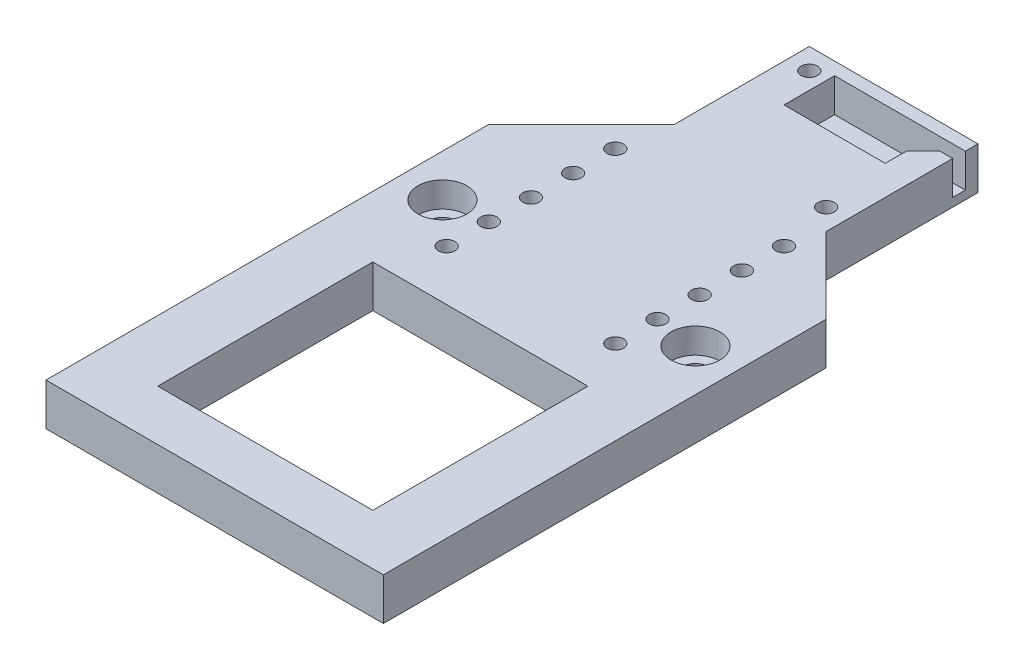
ISO-10303-21;
HEADER;
FILE_DESCRIPTION(('STEP AP214'),'2;1');
FILE_NAME('part.step','',(''),(''),'','','');
FILE_SCHEMA(('AUTOMOTIVE_DESIGN { 1 0 10303 214 1 1 1 1 }'));
ENDSEC;
DATA;
#1=APPLICATION_CONTEXT('core data for automotive mechanical design processes');
#2=APPLICATION_PROTOCOL_DEFINITION('international standard','automotive_design',2000,#1);
#3=PRODUCT_CONTEXT('',#1,'mechanical');
#4=PRODUCT('Part','Part','',(#3));
#5=PRODUCT_RELATED_PRODUCT_CATEGORY('part','',(#4));
#6=PRODUCT_DEFINITION_FORMATION('','',#4);
#7=PRODUCT_DEFINITION_CONTEXT('part definition',#1,'design');
#8=PRODUCT_DEFINITION('design','',#6,#7);
#9=PRODUCT_DEFINITION_SHAPE('','',#8);
#10=(LENGTH_UNIT() NAMED_UNIT(*) SI_UNIT(.MILLI.,.METRE.));
#11=(NAMED_UNIT(*) PLANE_ANGLE_UNIT() SI_UNIT($,.RADIAN.));
#12=(NAMED_UNIT(*) SI_UNIT($,.STERADIAN.) SOLID_ANGLE_UNIT());
#13=UNCERTAINTY_MEASURE_WITH_UNIT(LENGTH_MEASURE(1.E-05),#10,'distance_accuracy_value','');
#14=(GEOMETRIC_REPRESENTATION_CONTEXT(3) GLOBAL_UNCERTAINTY_ASSIGNED_CONTEXT((#13)) GLOBAL_UNIT_ASSIGNED_CONTEXT((#10,
#11,#12)) REPRESENTATION_CONTEXT('',''));
#15=CARTESIAN_POINT('',(0.,0.,0.));
#16=DIRECTION('',(0.,0.,1.));
#17=DIRECTION('',(1.,0.,0.));
#18=AXIS2_PLACEMENT_3D('',#15,#16,#17);
#19=CARTESIAN_POINT('',(-10.,0.,-0.5));
#20=DIRECTION('',(0.,1.,0.));
#21=DIRECTION('',(0.,0.,1.));
#22=AXIS2_PLACEMENT_3D('',#19,#20,#21);
#23=CYLINDRICAL_SURFACE('',#22,0.975);
#24=CARTESIAN_POINT('',(-10.,0.,-0.5));
#25=DIRECTION('',(0.,1.,0.));
#26=DIRECTION('',(0.,0.,1.));
#27=AXIS2_PLACEMENT_3D('',#24,#25,#26);
#28=CIRCLE('',#27,0.975);
#29=CARTESIAN_POINT('',(-10.,0.,0.474999999999999));
#30=VERTEX_POINT('',#29);
#31=EDGE_CURVE('E393',#30,#30,#28,.T.);
#32=ORIENTED_EDGE('',*,*,#31,.F.);
#33=EDGE_LOOP('',(#32));
#34=FACE_BOUND('',#33,.T.);
#35=CARTESIAN_POINT('',(-10.,5.,-0.5));
#36=DIRECTION('',(0.,1.,0.));
#37=DIRECTION('',(0.,0.,1.));
#38=AXIS2_PLACEMENT_3D('',#35,#36,#37);
#39=CIRCLE('',#38,0.975);
#40=CARTESIAN_POINT('',(-10.,5.,0.474999999999999));
#41=VERTEX_POINT('',#40);
#42=EDGE_CURVE('E396',#41,#41,#39,.T.);
#43=ORIENTED_EDGE('',*,*,#42,.T.);
#44=EDGE_LOOP('',(#43));
#45=FACE_BOUND('',#44,.T.);
#46=ADVANCED_FACE('F35',(#34,#45),#23,.F.);
#47=CARTESIAN_POINT('',(-10.,0.,4.5));
#48=DIRECTION('',(0.,1.,0.));
#49=DIRECTION('',(0.,0.,1.));
#50=AXIS2_PLACEMENT_3D('',#47,#48,#49);
#51=CYLINDRICAL_SURFACE('',#50,0.975);
#52=CARTESIAN_POINT('',(-10.,0.,4.5));
#53=DIRECTION('',(0.,1.,0.));
#54=DIRECTION('',(0.,0.,1.));
#55=AXIS2_PLACEMENT_3D('',#52,#53,#54);
#56=CIRCLE('',#55,0.975);
#57=CARTESIAN_POINT('',(-10.,0.,5.475));
#58=VERTEX_POINT('',#57);
#59=EDGE_CURVE('E387',#58,#58,#56,.T.);
#60=ORIENTED_EDGE('',*,*,#59,.F.);
#61=EDGE_LOOP('',(#60));
#62=FACE_BOUND('',#61,.T.);
#63=CARTESIAN_POINT('',(-10.,5.,4.5));
#64=DIRECTION('',(0.,1.,0.));
#65=DIRECTION('',(0.,0.,1.));
#66=AXIS2_PLACEMENT_3D('',#63,#64,#65);
#67=CIRCLE('',#66,0.975);
#68=CARTESIAN_POINT('',(-10.,5.,5.475));
#69=VERTEX_POINT('',#68);
#70=EDGE_CURVE('E390',#69,#69,#67,.T.);
#71=ORIENTED_EDGE('',*,*,#70,.T.);
#72=EDGE_LOOP('',(#71));
#73=FACE_BOUND('',#72,.T.);
#74=ADVANCED_FACE('F489',(#62,#73),#51,.F.);
#75=CARTESIAN_POINT('',(-10.,0.,9.5));
#76=DIRECTION('',(0.,1.,0.));
#77=DIRECTION('',(0.,0.,1.));
#78=AXIS2_PLACEMENT_3D('',#75,#76,#77);
#79=CYLINDRICAL_SURFACE('',#78,0.975);
#80=CARTESIAN_POINT('',(-10.,0.,9.5));
#81=DIRECTION('',(0.,1.,0.));
#82=DIRECTION('',(0.,0.,1.));
#83=AXIS2_PLACEMENT_3D('',#80,#81,#82);
#84=CIRCLE('',#83,0.975);
#85=CARTESIAN_POINT('',(-10.,0.,10.475));
#86=VERTEX_POINT('',#85);
#87=EDGE_CURVE('E381',#86,#86,#84,.T.);
#88=ORIENTED_EDGE('',*,*,#87,.F.);
#89=EDGE_LOOP('',(#88));
#90=FACE_BOUND('',#89,.T.);
#91=CARTESIAN_POINT('',(-10.,5.,9.5));
#92=DIRECTION('',(0.,1.,0.));
#93=DIRECTION('',(0.,0.,1.));
#94=AXIS2_PLACEMENT_3D('',#91,#92,#93);
#95=CIRCLE('',#94,0.975);
#96=CARTESIAN_POINT('',(-10.,5.,10.475));
#97=VERTEX_POINT('',#96);
#98=EDGE_CURVE('E384',#97,#97,#95,.T.);
#99=ORIENTED_EDGE('',*,*,#98,.T.);
#100=EDGE_LOOP('',(#99));
#101=FACE_BOUND('',#100,.T.);
#102=ADVANCED_FACE('F494',(#90,#101),#79,.F.);
#103=CARTESIAN_POINT('',(10.,0.,-0.500000000000004));
#104=DIRECTION('',(0.,1.,0.));
#105=DIRECTION('',(0.,0.,1.));
#106=AXIS2_PLACEMENT_3D('',#103,#104,#105);
#107=CYLINDRICAL_SURFACE('',#106,0.975);
#108=CARTESIAN_POINT('',(10.,0.,-0.500000000000004));
#109=DIRECTION('',(0.,1.,0.));
#110=DIRECTION('',(0.,0.,-1.));
#111=AXIS2_PLACEMENT_3D('',#108,#109,#110);
#112=CIRCLE('',#111,0.975);
#113=CARTESIAN_POINT('',(10.,0.,-1.475));
#114=VERTEX_POINT('',#113);
#115=EDGE_CURVE('E375',#114,#114,#112,.T.);
#116=ORIENTED_EDGE('',*,*,#115,.F.);
#117=EDGE_LOOP('',(#116));
#118=FACE_BOUND('',#117,.T.);
#119=CARTESIAN_POINT('',(10.,5.,-0.500000000000004));
#120=DIRECTION('',(0.,1.,0.));
#121=DIRECTION('',(0.,0.,-1.));
#122=AXIS2_PLACEMENT_3D('',#119,#120,#121);
#123=CIRCLE('',#122,0.975);
#124=CARTESIAN_POINT('',(10.,5.,-1.475));
#125=VERTEX_POINT('',#124);
#126=EDGE_CURVE('E378',#125,#125,#123,.T.);
#127=ORIENTED_EDGE('',*,*,#126,.T.);
#128=EDGE_LOOP('',(#127));
#129=FACE_BOUND('',#128,.T.);
#130=ADVANCED_FACE('F502',(#118,#129),#107,.F.);
#131=CARTESIAN_POINT('',(10.,0.,4.5));
#132=DIRECTION('',(0.,1.,0.));
#133=DIRECTION('',(0.,0.,1.));
#134=AXIS2_PLACEMENT_3D('',#131,#132,#133);
#135=CYLINDRICAL_SURFACE('',#134,0.975);
#136=CARTESIAN_POINT('',(10.,0.,4.5));
#137=DIRECTION('',(0.,1.,0.));
#138=DIRECTION('',(0.,0.,-1.));
#139=AXIS2_PLACEMENT_3D('',#136,#137,#138);
#140=CIRCLE('',#139,0.975);
#141=CARTESIAN_POINT('',(10.,0.,3.525));
#142=VERTEX_POINT('',#141);
#143=EDGE_CURVE('E369',#142,#142,#140,.T.);
#144=ORIENTED_EDGE('',*,*,#143,.F.);
#145=EDGE_LOOP('',(#144));
#146=FACE_BOUND('',#145,.T.);
#147=CARTESIAN_POINT('',(10.,5.,4.5));
#148=DIRECTION('',(0.,1.,0.));
#149=DIRECTION('',(0.,0.,-1.));
#150=AXIS2_PLACEMENT_3D('',#147,#148,#149);
#151=CIRCLE('',#150,0.975);
#152=CARTESIAN_POINT('',(10.,5.,3.525));
#153=VERTEX_POINT('',#152);
#154=EDGE_CURVE('E372',#153,#153,#151,.T.);
#155=ORIENTED_EDGE('',*,*,#154,.T.);
#156=EDGE_LOOP('',(#155));
#157=FACE_BOUND('',#156,.T.);
#158=ADVANCED_FACE('F506',(#146,#157),#135,.F.);
#159=CARTESIAN_POINT('',(10.,0.,9.49999999999999));
#160=DIRECTION('',(0.,1.,0.));
#161=DIRECTION('',(0.,0.,1.));
#162=AXIS2_PLACEMENT_3D('',#159,#160,#161);
#163=CYLINDRICAL_SURFACE('',#162,0.975);
#164=CARTESIAN_POINT('',(10.,0.,9.49999999999999));
#165=DIRECTION('',(0.,1.,0.));
#166=DIRECTION('',(0.,0.,-1.));
#167=AXIS2_PLACEMENT_3D('',#164,#165,#166);
#168=CIRCLE('',#167,0.975);
#169=CARTESIAN_POINT('',(10.,0.,8.525));
#170=VERTEX_POINT('',#169);
#171=EDGE_CURVE('E356',#170,#170,#168,.T.);
#172=ORIENTED_EDGE('',*,*,#171,.F.);
#173=EDGE_LOOP('',(#172));
#174=FACE_BOUND('',#173,.T.);
#175=CARTESIAN_POINT('',(10.,5.,9.49999999999999));
#176=DIRECTION('',(0.,1.,0.));
#177=DIRECTION('',(0.,0.,-1.));
#178=AXIS2_PLACEMENT_3D('',#175,#176,#177);
#179=CIRCLE('',#178,0.975);
#180=CARTESIAN_POINT('',(10.,5.,8.525));
#181=VERTEX_POINT('',#180);
#182=EDGE_CURVE('E366',#181,#181,#179,.T.);
#183=ORIENTED_EDGE('',*,*,#182,.T.);
#184=EDGE_LOOP('',(#183));
#185=FACE_BOUND('',#184,.T.);
#186=ADVANCED_FACE('F510',(#174,#185),#163,.F.);
#187=CARTESIAN_POINT('',(0.,5.,0.));
#188=DIRECTION('',(0.,-1.,0.));
#189=DIRECTION('',(0.,0.,-1.));
#190=AXIS2_PLACEMENT_3D('',#187,#188,#189);
#191=PLANE('',#190);
#192=DIRECTION('',(0.,0.,-1.));
#193=VECTOR('',#192,1.);
#194=CARTESIAN_POINT('',(20.,5.,22.5));
#195=LINE('',#194,#193);
#196=CARTESIAN_POINT('',(20.,5.,57.));
#197=VERTEX_POINT('',#196);
#198=CARTESIAN_POINT('',(20.,5.,4.50000000000006));
#199=VERTEX_POINT('',#198);
#200=EDGE_CURVE('E186',#197,#199,#195,.T.);
#201=ORIENTED_EDGE('',*,*,#200,.T.);
#202=DIRECTION('',(0.707106781186544,0.,0.707106781186551));
#203=VECTOR('',#202,1.);
#204=CARTESIAN_POINT('',(11.,5.,-4.50000000000001));
#205=LINE('',#204,#203);
#206=CARTESIAN_POINT('',(11.,5.,-4.50000000000001));
#207=VERTEX_POINT('',#206);
#208=EDGE_CURVE('E227',#207,#199,#205,.T.);
#209=ORIENTED_EDGE('',*,*,#208,.F.);
#210=DIRECTION('',(0.,0.,1.));
#211=VECTOR('',#210,1.);
#212=CARTESIAN_POINT('',(11.,5.,-22.5));
#213=LINE('',#212,#211);
#214=CARTESIAN_POINT('',(11.,5.,-19.5));
#215=VERTEX_POINT('',#214);
#216=EDGE_CURVE('E212',#215,#207,#213,.T.);
#217=ORIENTED_EDGE('',*,*,#216,.F.);
#218=DIRECTION('',(1.,0.,0.));
#219=VECTOR('',#218,1.);
#220=CARTESIAN_POINT('',(15.5,5.,-19.5));
#221=LINE('',#220,#219);
#222=CARTESIAN_POINT('',(9.5,5.,-19.5));
#223=VERTEX_POINT('',#222);
#224=EDGE_CURVE('E265',#223,#215,#221,.T.);
#225=ORIENTED_EDGE('',*,*,#224,.F.);
#226=DIRECTION('',(0.707106781186545,0.,-0.70710678118655));
#227=VECTOR('',#226,1.);
#228=CARTESIAN_POINT('',(9.5,5.,-19.5));
#229=LINE('',#228,#227);
#230=CARTESIAN_POINT('',(7.5,5.,-17.5));
#231=VERTEX_POINT('',#230);
#232=EDGE_CURVE('E402',#223,#231,#229,.F.);
#233=ORIENTED_EDGE('',*,*,#232,.T.);
#234=DIRECTION('',(0.,0.,-1.));
#235=VECTOR('',#234,1.);
#236=CARTESIAN_POINT('',(7.5,5.,-19.5));
#237=LINE('',#236,#235);
#238=CARTESIAN_POINT('',(7.5,5.,-15.));
#239=VERTEX_POINT('',#238);
#240=EDGE_CURVE('E268',#239,#231,#237,.T.);
#241=ORIENTED_EDGE('',*,*,#240,.F.);
#242=DIRECTION('',(1.,0.,0.));
#243=VECTOR('',#242,1.);
#244=CARTESIAN_POINT('',(-4.5,5.,-15.));
#245=LINE('',#244,#243);
#246=CARTESIAN_POINT('',(-4.5,5.,-15.));
#247=VERTEX_POINT('',#246);
#248=EDGE_CURVE('E271',#247,#239,#245,.T.);
#249=ORIENTED_EDGE('',*,*,#248,.F.);
#250=DIRECTION('',(0.,0.,1.));
#251=VECTOR('',#250,1.);
#252=CARTESIAN_POINT('',(-4.5,5.,-21.));
#253=LINE('',#252,#251);
#254=CARTESIAN_POINT('',(-4.5,5.,-21.));
#255=VERTEX_POINT('',#254);
#256=EDGE_CURVE('E258',#255,#247,#253,.T.);
#257=ORIENTED_EDGE('',*,*,#256,.F.);
#258=DIRECTION('',(-1.,0.,0.));
#259=VECTOR('',#258,1.);
#260=CARTESIAN_POINT('',(-4.5,5.,-21.));
#261=LINE('',#260,#259);
#262=CARTESIAN_POINT('',(11.,5.,-21.));
#263=VERTEX_POINT('',#262);
#264=EDGE_CURVE('E262',#263,#255,#261,.T.);
#265=ORIENTED_EDGE('',*,*,#264,.F.);
#266=CARTESIAN_POINT('',(11.,5.,-22.5));
#267=VERTEX_POINT('',#266);
#268=EDGE_CURVE('E50',#267,#263,#213,.T.);
#269=ORIENTED_EDGE('',*,*,#268,.F.);
#270=DIRECTION('',(-1.,0.,0.));
#271=VECTOR('',#270,1.);
#272=CARTESIAN_POINT('',(-20.,5.,-22.5));
#273=LINE('',#272,#271);
#274=CARTESIAN_POINT('',(-9.00000000000001,5.,-22.5));
#275=VERTEX_POINT('',#274);
#276=EDGE_CURVE('E352',#267,#275,#273,.T.);
#277=ORIENTED_EDGE('',*,*,#276,.T.);
#278=DIRECTION('',(0.,0.,-1.));
#279=VECTOR('',#278,1.);
#280=CARTESIAN_POINT('',(-9.00000000000001,5.,-22.5));
#281=LINE('',#280,#279);
#282=CARTESIAN_POINT('',(-9.00000000000001,5.,-6.49999999999985));
#283=VERTEX_POINT('',#282);
#284=EDGE_CURVE('E247',#283,#275,#281,.T.);
#285=ORIENTED_EDGE('',*,*,#284,.F.);
#286=DIRECTION('',(0.70710678118655,0.,-0.707106781186545));
#287=VECTOR('',#286,1.);
#288=CARTESIAN_POINT('',(-9.00000000000001,5.,-6.49999999999985));
#289=LINE('',#288,#287);
#290=CARTESIAN_POINT('',(-20.,5.,4.50000000000006));
#291=VERTEX_POINT('',#290);
#292=EDGE_CURVE('E244',#291,#283,#289,.T.);
#293=ORIENTED_EDGE('',*,*,#292,.F.);
#294=DIRECTION('',(0.,0.,1.));
#295=VECTOR('',#294,1.);
#296=CARTESIAN_POINT('',(-20.,5.,22.5));
#297=LINE('',#296,#295);
#298=CARTESIAN_POINT('',(-20.,5.,57.));
#299=VERTEX_POINT('',#298);
#300=EDGE_CURVE('E355',#291,#299,#297,.T.);
#301=ORIENTED_EDGE('',*,*,#300,.T.);
#302=DIRECTION('',(1.,0.,0.));
#303=VECTOR('',#302,1.);
#304=CARTESIAN_POINT('',(-20.,5.,57.));
#305=LINE('',#304,#303);
#306=EDGE_CURVE('E208',#299,#197,#305,.T.);
#307=ORIENTED_EDGE('',*,*,#306,.T.);
#308=EDGE_LOOP('',(#201,#209,#217,#225,#233,#241,#249,#257,#265,#269,#277,#285,#293,#301,#307));
#309=FACE_BOUND('',#308,.T.);
#310=CARTESIAN_POINT('',(-10.,5.,14.5));
#311=DIRECTION('',(0.,1.,0.));
#312=DIRECTION('',(0.,0.,1.));
#313=AXIS2_PLACEMENT_3D('',#310,#311,#312);
#314=CIRCLE('',#313,0.975);
#315=CARTESIAN_POINT('',(-10.,5.,15.475));
#316=VERTEX_POINT('',#315);
#317=EDGE_CURVE('E299',#316,#316,#314,.T.);
#318=ORIENTED_EDGE('',*,*,#317,.F.);
#319=EDGE_LOOP('',(#318));
#320=FACE_BOUND('',#319,.T.);
#321=CARTESIAN_POINT('',(10.,5.,14.5));
#322=DIRECTION('',(0.,1.,0.));
#323=DIRECTION('',(0.,0.,-1.));
#324=AXIS2_PLACEMENT_3D('',#321,#322,#323);
#325=CIRCLE('',#324,0.975);
#326=CARTESIAN_POINT('',(10.,5.,13.525));
#327=VERTEX_POINT('',#326);
#328=EDGE_CURVE('E305',#327,#327,#325,.T.);
#329=ORIENTED_EDGE('',*,*,#328,.F.);
#330=EDGE_LOOP('',(#329));
#331=FACE_BOUND('',#330,.T.);
#332=CARTESIAN_POINT('',(10.,5.,19.5));
#333=DIRECTION('',(0.,1.,0.));
#334=DIRECTION('',(0.,0.,-1.));
#335=AXIS2_PLACEMENT_3D('',#332,#333,#334);
#336=CIRCLE('',#335,0.975);
#337=CARTESIAN_POINT('',(10.,5.,18.525));
#338=VERTEX_POINT('',#337);
#339=EDGE_CURVE('E308',#338,#338,#336,.T.);
#340=ORIENTED_EDGE('',*,*,#339,.F.);
#341=EDGE_LOOP('',(#340));
#342=FACE_BOUND('',#341,.T.);
#343=CARTESIAN_POINT('',(-10.,5.,19.5));
#344=DIRECTION('',(0.,1.,0.));
#345=DIRECTION('',(0.,0.,1.));
#346=AXIS2_PLACEMENT_3D('',#343,#344,#345);
#347=CIRCLE('',#346,0.975);
#348=CARTESIAN_POINT('',(-10.,5.,20.475));
#349=VERTEX_POINT('',#348);
#350=EDGE_CURVE('E312',#349,#349,#347,.T.);
#351=ORIENTED_EDGE('',*,*,#350,.F.);
#352=EDGE_LOOP('',(#351));
#353=FACE_BOUND('',#352,.T.);
#354=CARTESIAN_POINT('',(8.49999999999999,5.,-7.));
#355=DIRECTION('',(0.,1.,0.));
#356=DIRECTION('',(0.,0.,1.));
#357=AXIS2_PLACEMENT_3D('',#354,#355,#356);
#358=CIRCLE('',#357,0.975);
#359=CARTESIAN_POINT('',(8.49999999999999,5.,-6.025));
#360=VERTEX_POINT('',#359);
#361=EDGE_CURVE('E318',#360,#360,#358,.T.);
#362=ORIENTED_EDGE('',*,*,#361,.F.);
#363=EDGE_LOOP('',(#362));
#364=FACE_BOUND('',#363,.T.);
#365=CARTESIAN_POINT('',(-6.50000000000001,5.,-20.));
#366=DIRECTION('',(0.,1.,0.));
#367=DIRECTION('',(0.,0.,1.));
#368=AXIS2_PLACEMENT_3D('',#365,#366,#367);
#369=CIRCLE('',#368,0.975);
#370=CARTESIAN_POINT('',(-6.50000000000001,5.,-19.025));
#371=VERTEX_POINT('',#370);
#372=EDGE_CURVE('E324',#371,#371,#369,.T.);
#373=ORIENTED_EDGE('',*,*,#372,.F.);
#374=EDGE_LOOP('',(#373));
#375=FACE_BOUND('',#374,.T.);
#376=CARTESIAN_POINT('',(15.,5.,15.));
#377=DIRECTION('',(0.,1.,0.));
#378=DIRECTION('',(0.,0.,1.));
#379=AXIS2_PLACEMENT_3D('',#376,#377,#378);
#380=CIRCLE('',#379,2.9);
#381=CARTESIAN_POINT('',(15.,5.,17.9));
#382=VERTEX_POINT('',#381);
#383=EDGE_CURVE('E330',#382,#382,#380,.T.);
#384=ORIENTED_EDGE('',*,*,#383,.F.);
#385=EDGE_LOOP('',(#384));
#386=FACE_BOUND('',#385,.T.);
#387=CARTESIAN_POINT('',(-15.,5.,15.));
#388=DIRECTION('',(0.,1.,0.));
#389=DIRECTION('',(0.,0.,1.));
#390=AXIS2_PLACEMENT_3D('',#387,#388,#389);
#391=CIRCLE('',#390,2.9);
#392=CARTESIAN_POINT('',(-15.,5.,17.9));
#393=VERTEX_POINT('',#392);
#394=EDGE_CURVE('E339',#393,#393,#391,.T.);
#395=ORIENTED_EDGE('',*,*,#394,.F.);
#396=EDGE_LOOP('',(#395));
#397=FACE_BOUND('',#396,.T.);
#398=ORIENTED_EDGE('',*,*,#182,.F.);
#399=EDGE_LOOP('',(#398));
#400=FACE_BOUND('',#399,.T.);
#401=ORIENTED_EDGE('',*,*,#154,.F.);
#402=EDGE_LOOP('',(#401));
#403=FACE_BOUND('',#402,.T.);
#404=ORIENTED_EDGE('',*,*,#126,.F.);
#405=EDGE_LOOP('',(#404));
#406=FACE_BOUND('',#405,.T.);
#407=ORIENTED_EDGE('',*,*,#98,.F.);
#408=EDGE_LOOP('',(#407));
#409=FACE_BOUND('',#408,.T.);
#410=ORIENTED_EDGE('',*,*,#70,.F.);
#411=EDGE_LOOP('',(#410));
#412=FACE_BOUND('',#411,.T.);
#413=ORIENTED_EDGE('',*,*,#42,.F.);
#414=EDGE_LOOP('',(#413));
#415=FACE_BOUND('',#414,.T.);
#416=DIRECTION('',(0.,0.,-1.));
#417=VECTOR('',#416,1.);
#418=CARTESIAN_POINT('',(12.75,5.,51.));
#419=LINE('',#418,#417);
#420=CARTESIAN_POINT('',(12.75,5.,51.));
#421=VERTEX_POINT('',#420);
#422=CARTESIAN_POINT('',(12.75,5.,25.5));
#423=VERTEX_POINT('',#422);
#424=EDGE_CURVE('E199',#421,#423,#419,.T.);
#425=ORIENTED_EDGE('',*,*,#424,.F.);
#426=DIRECTION('',(1.,0.,0.));
#427=VECTOR('',#426,1.);
#428=CARTESIAN_POINT('',(-12.75,5.,51.));
#429=LINE('',#428,#427);
#430=CARTESIAN_POINT('',(-12.75,5.,51.));
#431=VERTEX_POINT('',#430);
#432=EDGE_CURVE('E218',#431,#421,#429,.T.);
#433=ORIENTED_EDGE('',*,*,#432,.F.);
#434=DIRECTION('',(0.,0.,1.));
#435=VECTOR('',#434,1.);
#436=CARTESIAN_POINT('',(-12.75,5.,51.));
#437=LINE('',#436,#435);
#438=CARTESIAN_POINT('',(-12.75,5.,25.5));
#439=VERTEX_POINT('',#438);
#440=EDGE_CURVE('E221',#439,#431,#437,.T.);
#441=ORIENTED_EDGE('',*,*,#440,.F.);
#442=DIRECTION('',(-1.,0.,0.));
#443=VECTOR('',#442,1.);
#444=CARTESIAN_POINT('',(-12.75,5.,25.5));
#445=LINE('',#444,#443);
#446=EDGE_CURVE('E224',#423,#439,#445,.T.);
#447=ORIENTED_EDGE('',*,*,#446,.F.);
#448=EDGE_LOOP('',(#425,#433,#441,#447));
#449=FACE_BOUND('',#448,.T.);
#450=ADVANCED_FACE('F417',(#309,#320,#331,#342,#353,#364,#375,#386,#397,#400,#403,#406,#409,
#412,#415,#449),#191,.F.);
#451=CARTESIAN_POINT('',(0.,0.,0.));
#452=DIRECTION('',(0.,-1.,0.));
#453=DIRECTION('',(0.,0.,-1.));
#454=AXIS2_PLACEMENT_3D('',#451,#452,#453);
#455=PLANE('',#454);
#456=DIRECTION('',(0.707106781186544,0.,0.707106781186551));
#457=VECTOR('',#456,1.);
#458=CARTESIAN_POINT('',(11.,0.,-4.50000000000001));
#459=LINE('',#458,#457);
#460=CARTESIAN_POINT('',(11.,0.,-4.50000000000001));
#461=VERTEX_POINT('',#460);
#462=CARTESIAN_POINT('',(20.,0.,4.50000000000006));
#463=VERTEX_POINT('',#462);
#464=EDGE_CURVE('E176',#461,#463,#459,.T.);
#465=ORIENTED_EDGE('',*,*,#464,.T.);
#466=DIRECTION('',(0.,0.,-1.));
#467=VECTOR('',#466,1.);
#468=CARTESIAN_POINT('',(20.,0.,22.5));
#469=LINE('',#468,#467);
#470=CARTESIAN_POINT('',(20.,0.,57.));
#471=VERTEX_POINT('',#470);
#472=EDGE_CURVE('E166',#471,#463,#469,.T.);
#473=ORIENTED_EDGE('',*,*,#472,.F.);
#474=DIRECTION('',(1.,0.,0.));
#475=VECTOR('',#474,1.);
#476=CARTESIAN_POINT('',(-20.,0.,57.));
#477=LINE('',#476,#475);
#478=CARTESIAN_POINT('',(-20.,0.,57.));
#479=VERTEX_POINT('',#478);
#480=EDGE_CURVE('E172',#479,#471,#477,.T.);
#481=ORIENTED_EDGE('',*,*,#480,.F.);
#482=DIRECTION('',(0.,0.,1.));
#483=VECTOR('',#482,1.);
#484=CARTESIAN_POINT('',(-20.,0.,22.5));
#485=LINE('',#484,#483);
#486=CARTESIAN_POINT('',(-20.,0.,4.50000000000006));
#487=VERTEX_POINT('',#486);
#488=EDGE_CURVE('E353',#487,#479,#485,.T.);
#489=ORIENTED_EDGE('',*,*,#488,.F.);
#490=DIRECTION('',(0.70710678118655,0.,-0.707106781186545));
#491=VECTOR('',#490,1.);
#492=CARTESIAN_POINT('',(-9.00000000000001,0.,-6.49999999999985));
#493=LINE('',#492,#491);
#494=CARTESIAN_POINT('',(-9.00000000000001,0.,-6.49999999999985));
#495=VERTEX_POINT('',#494);
#496=EDGE_CURVE('E57',#487,#495,#493,.T.);
#497=ORIENTED_EDGE('',*,*,#496,.T.);
#498=DIRECTION('',(0.,0.,-1.));
#499=VECTOR('',#498,1.);
#500=CARTESIAN_POINT('',(-9.00000000000001,0.,-22.5));
#501=LINE('',#500,#499);
#502=CARTESIAN_POINT('',(-9.00000000000001,0.,-22.5));
#503=VERTEX_POINT('',#502);
#504=EDGE_CURVE('E246',#495,#503,#501,.T.);
#505=ORIENTED_EDGE('',*,*,#504,.T.);
#506=DIRECTION('',(-1.,0.,0.));
#507=VECTOR('',#506,1.);
#508=CARTESIAN_POINT('',(-20.,0.,-22.5));
#509=LINE('',#508,#507);
#510=CARTESIAN_POINT('',(11.,0.,-22.5));
#511=VERTEX_POINT('',#510);
#512=EDGE_CURVE('E179',#511,#503,#509,.T.);
#513=ORIENTED_EDGE('',*,*,#512,.F.);
#514=DIRECTION('',(0.,0.,1.));
#515=VECTOR('',#514,1.);
#516=CARTESIAN_POINT('',(11.,0.,-22.5));
#517=LINE('',#516,#515);
#518=EDGE_CURVE('E225',#511,#461,#517,.T.);
#519=ORIENTED_EDGE('',*,*,#518,.T.);
#520=EDGE_LOOP('',(#465,#473,#481,#489,#497,#505,#513,#519));
#521=FACE_BOUND('',#520,.T.);
#522=CARTESIAN_POINT('',(-10.,0.,14.5));
#523=DIRECTION('',(0.,1.,0.));
#524=DIRECTION('',(0.,0.,1.));
#525=AXIS2_PLACEMENT_3D('',#522,#523,#524);
#526=CIRCLE('',#525,0.975);
#527=CARTESIAN_POINT('',(-10.,0.,15.475));
#528=VERTEX_POINT('',#527);
#529=EDGE_CURVE('E296',#528,#528,#526,.T.);
#530=ORIENTED_EDGE('',*,*,#529,.T.);
#531=EDGE_LOOP('',(#530));
#532=FACE_BOUND('',#531,.T.);
#533=CARTESIAN_POINT('',(10.,0.,14.5));
#534=DIRECTION('',(0.,1.,0.));
#535=DIRECTION('',(0.,0.,-1.));
#536=AXIS2_PLACEMENT_3D('',#533,#534,#535);
#537=CIRCLE('',#536,0.975);
#538=CARTESIAN_POINT('',(10.,0.,13.525));
#539=VERTEX_POINT('',#538);
#540=EDGE_CURVE('E302',#539,#539,#537,.T.);
#541=ORIENTED_EDGE('',*,*,#540,.T.);
#542=EDGE_LOOP('',(#541));
#543=FACE_BOUND('',#542,.T.);
#544=CARTESIAN_POINT('',(10.,0.,19.5));
#545=DIRECTION('',(0.,1.,0.));
#546=DIRECTION('',(0.,0.,-1.));
#547=AXIS2_PLACEMENT_3D('',#544,#545,#546);
#548=CIRCLE('',#547,0.975);
#549=CARTESIAN_POINT('',(10.,0.,18.525));
#550=VERTEX_POINT('',#549);
#551=EDGE_CURVE('E309',#550,#550,#548,.T.);
#552=ORIENTED_EDGE('',*,*,#551,.T.);
#553=EDGE_LOOP('',(#552));
#554=FACE_BOUND('',#553,.T.);
#555=CARTESIAN_POINT('',(-10.,0.,19.5));
#556=DIRECTION('',(0.,1.,0.));
#557=DIRECTION('',(0.,0.,1.));
#558=AXIS2_PLACEMENT_3D('',#555,#556,#557);
#559=CIRCLE('',#558,0.975);
#560=CARTESIAN_POINT('',(-10.,0.,20.475));
#561=VERTEX_POINT('',#560);
#562=EDGE_CURVE('E315',#561,#561,#559,.T.);
#563=ORIENTED_EDGE('',*,*,#562,.T.);
#564=EDGE_LOOP('',(#563));
#565=FACE_BOUND('',#564,.T.);
#566=CARTESIAN_POINT('',(8.49999999999999,0.,-7.));
#567=DIRECTION('',(0.,1.,0.));
#568=DIRECTION('',(0.,0.,1.));
#569=AXIS2_PLACEMENT_3D('',#566,#567,#568);
#570=CIRCLE('',#569,0.975);
#571=CARTESIAN_POINT('',(8.49999999999999,0.,-6.025));
#572=VERTEX_POINT('',#571);
#573=EDGE_CURVE('E321',#572,#572,#570,.T.);
#574=ORIENTED_EDGE('',*,*,#573,.T.);
#575=EDGE_LOOP('',(#574));
#576=FACE_BOUND('',#575,.T.);
#577=CARTESIAN_POINT('',(-6.50000000000001,0.,-20.));
#578=DIRECTION('',(0.,1.,0.));
#579=DIRECTION('',(0.,0.,1.));
#580=AXIS2_PLACEMENT_3D('',#577,#578,#579);
#581=CIRCLE('',#580,0.975);
#582=CARTESIAN_POINT('',(-6.50000000000001,0.,-19.025));
#583=VERTEX_POINT('',#582);
#584=EDGE_CURVE('E327',#583,#583,#581,.T.);
#585=ORIENTED_EDGE('',*,*,#584,.T.);
#586=EDGE_LOOP('',(#585));
#587=FACE_BOUND('',#586,.T.);
#588=CARTESIAN_POINT('',(15.,0.,15.));
#589=DIRECTION('',(0.,1.,0.));
#590=DIRECTION('',(0.,0.,-1.));
#591=AXIS2_PLACEMENT_3D('',#588,#589,#590);
#592=CIRCLE('',#591,1.7);
#593=CARTESIAN_POINT('',(15.,0.,13.3));
#594=VERTEX_POINT('',#593);
#595=EDGE_CURVE('E346',#594,#594,#592,.T.);
#596=ORIENTED_EDGE('',*,*,#595,.T.);
#597=EDGE_LOOP('',(#596));
#598=FACE_BOUND('',#597,.T.);
#599=CARTESIAN_POINT('',(-15.,0.,15.));
#600=DIRECTION('',(0.,1.,0.));
#601=DIRECTION('',(0.,0.,1.));
#602=AXIS2_PLACEMENT_3D('',#599,#600,#601);
#603=CIRCLE('',#602,1.7);
#604=CARTESIAN_POINT('',(-15.,0.,16.7));
#605=VERTEX_POINT('',#604);
#606=EDGE_CURVE('E180',#605,#605,#603,.T.);
#607=ORIENTED_EDGE('',*,*,#606,.T.);
#608=EDGE_LOOP('',(#607));
#609=FACE_BOUND('',#608,.T.);
#610=ORIENTED_EDGE('',*,*,#171,.T.);
#611=EDGE_LOOP('',(#610));
#612=FACE_BOUND('',#611,.T.);
#613=ORIENTED_EDGE('',*,*,#143,.T.);
#614=EDGE_LOOP('',(#613));
#615=FACE_BOUND('',#614,.T.);
#616=ORIENTED_EDGE('',*,*,#115,.T.);
#617=EDGE_LOOP('',(#616));
#618=FACE_BOUND('',#617,.T.);
#619=ORIENTED_EDGE('',*,*,#87,.T.);
#620=EDGE_LOOP('',(#619));
#621=FACE_BOUND('',#620,.T.);
#622=ORIENTED_EDGE('',*,*,#59,.T.);
#623=EDGE_LOOP('',(#622));
#624=FACE_BOUND('',#623,.T.);
#625=ORIENTED_EDGE('',*,*,#31,.T.);
#626=EDGE_LOOP('',(#625));
#627=FACE_BOUND('',#626,.T.);
#628=DIRECTION('',(1.,0.,0.));
#629=VECTOR('',#628,1.);
#630=CARTESIAN_POINT('',(-12.75,0.,51.));
#631=LINE('',#630,#629);
#632=CARTESIAN_POINT('',(-12.75,0.,51.));
#633=VERTEX_POINT('',#632);
#634=CARTESIAN_POINT('',(12.75,0.,51.));
#635=VERTEX_POINT('',#634);
#636=EDGE_CURVE('E205',#633,#635,#631,.T.);
#637=ORIENTED_EDGE('',*,*,#636,.T.);
#638=DIRECTION('',(0.,0.,-1.));
#639=VECTOR('',#638,1.);
#640=CARTESIAN_POINT('',(12.75,0.,51.));
#641=LINE('',#640,#639);
#642=CARTESIAN_POINT('',(12.75,0.,25.5));
#643=VERTEX_POINT('',#642);
#644=EDGE_CURVE('E201',#635,#643,#641,.T.);
#645=ORIENTED_EDGE('',*,*,#644,.T.);
#646=DIRECTION('',(-1.,0.,0.));
#647=VECTOR('',#646,1.);
#648=CARTESIAN_POINT('',(-12.75,0.,25.5));
#649=LINE('',#648,#647);
#650=CARTESIAN_POINT('',(-12.75,0.,25.5));
#651=VERTEX_POINT('',#650);
#652=EDGE_CURVE('E204',#643,#651,#649,.T.);
#653=ORIENTED_EDGE('',*,*,#652,.T.);
#654=DIRECTION('',(0.,0.,1.));
#655=VECTOR('',#654,1.);
#656=CARTESIAN_POINT('',(-12.75,0.,51.));
#657=LINE('',#656,#655);
#658=EDGE_CURVE('E209',#651,#633,#657,.T.);
#659=ORIENTED_EDGE('',*,*,#658,.T.);
#660=EDGE_LOOP('',(#637,#645,#653,#659));
#661=FACE_BOUND('',#660,.T.);
#662=ADVANCED_FACE('F168',(#521,#532,#543,#554,#565,#576,#587,#598,#609,#612,#615,#618,#621,
#624,#627,#661),#455,.T.);
#663=CARTESIAN_POINT('',(20.,5.,22.5));
#664=DIRECTION('',(-1.,0.,0.));
#665=DIRECTION('',(0.,0.,1.));
#666=AXIS2_PLACEMENT_3D('',#663,#664,#665);
#667=PLANE('',#666);
#668=ORIENTED_EDGE('',*,*,#472,.T.);
#669=DIRECTION('',(0.,1.,0.));
#670=VECTOR('',#669,1.);
#671=CARTESIAN_POINT('',(20.,0.,4.50000000000006));
#672=LINE('',#671,#670);
#673=EDGE_CURVE('E232',#463,#199,#672,.T.);
#674=ORIENTED_EDGE('',*,*,#673,.T.);
#675=ORIENTED_EDGE('',*,*,#200,.F.);
#676=DIRECTION('',(0.,1.,0.));
#677=VECTOR('',#676,1.);
#678=CARTESIAN_POINT('',(20.,-52.8228170396089,57.));
#679=LINE('',#678,#677);
#680=EDGE_CURVE('E183',#471,#197,#679,.T.);
#681=ORIENTED_EDGE('',*,*,#680,.F.);
#682=EDGE_LOOP('',(#668,#674,#675,#681));
#683=FACE_BOUND('',#682,.T.);
#684=ADVANCED_FACE('F184',(#683),#667,.F.);
#685=CARTESIAN_POINT('',(-20.,5.,-22.5));
#686=DIRECTION('',(0.,0.,1.));
#687=DIRECTION('',(1.,0.,0.));
#688=AXIS2_PLACEMENT_3D('',#685,#686,#687);
#689=PLANE('',#688);
#690=ORIENTED_EDGE('',*,*,#276,.F.);
#691=DIRECTION('',(0.,1.,0.));
#692=VECTOR('',#691,1.);
#693=CARTESIAN_POINT('',(11.,0.,-22.5));
#694=LINE('',#693,#692);
#695=EDGE_CURVE('E229',#511,#267,#694,.T.);
#696=ORIENTED_EDGE('',*,*,#695,.F.);
#697=ORIENTED_EDGE('',*,*,#512,.T.);
#698=DIRECTION('',(0.,1.,0.));
#699=VECTOR('',#698,1.);
#700=CARTESIAN_POINT('',(-9.00000000000001,0.,-22.5));
#701=LINE('',#700,#699);
#702=EDGE_CURVE('E255',#503,#275,#701,.T.);
#703=ORIENTED_EDGE('',*,*,#702,.T.);
#704=EDGE_LOOP('',(#690,#696,#697,#703));
#705=FACE_BOUND('',#704,.T.);
#706=ADVANCED_FACE('F444',(#705),#689,.F.);
#707=CARTESIAN_POINT('',(-20.,5.,22.5));
#708=DIRECTION('',(1.,0.,0.));
#709=DIRECTION('',(0.,0.,-1.));
#710=AXIS2_PLACEMENT_3D('',#707,#708,#709);
#711=PLANE('',#710);
#712=ORIENTED_EDGE('',*,*,#300,.F.);
#713=DIRECTION('',(0.,1.,0.));
#714=VECTOR('',#713,1.);
#715=CARTESIAN_POINT('',(-20.,0.,4.50000000000006));
#716=LINE('',#715,#714);
#717=EDGE_CURVE('E250',#487,#291,#716,.T.);
#718=ORIENTED_EDGE('',*,*,#717,.F.);
#719=ORIENTED_EDGE('',*,*,#488,.T.);
#720=DIRECTION('',(0.,1.,0.));
#721=VECTOR('',#720,1.);
#722=CARTESIAN_POINT('',(-20.,-52.8228170396089,57.));
#723=LINE('',#722,#721);
#724=EDGE_CURVE('E194',#479,#299,#723,.T.);
#725=ORIENTED_EDGE('',*,*,#724,.T.);
#726=EDGE_LOOP('',(#712,#718,#719,#725));
#727=FACE_BOUND('',#726,.T.);
#728=ADVANCED_FACE('F453',(#727),#711,.F.);
#729=CARTESIAN_POINT('',(-15.,5.,15.));
#730=DIRECTION('',(0.,-1.,0.));
#731=DIRECTION('',(0.,0.,-1.));
#732=AXIS2_PLACEMENT_3D('',#729,#730,#731);
#733=CYLINDRICAL_SURFACE('',#732,1.7);
#734=CARTESIAN_POINT('',(-15.,2.,15.));
#735=DIRECTION('',(0.,-1.,0.));
#736=DIRECTION('',(0.,0.,-1.));
#737=AXIS2_PLACEMENT_3D('',#734,#735,#736);
#738=CIRCLE('',#737,1.7);
#739=CARTESIAN_POINT('',(-15.,2.,13.3));
#740=VERTEX_POINT('',#739);
#741=EDGE_CURVE('E345',#740,#740,#738,.T.);
#742=ORIENTED_EDGE('',*,*,#741,.F.);
#743=EDGE_LOOP('',(#742));
#744=FACE_BOUND('',#743,.T.);
#745=ORIENTED_EDGE('',*,*,#606,.F.);
#746=EDGE_LOOP('',(#745));
#747=FACE_BOUND('',#746,.T.);
#748=ADVANCED_FACE('F521',(#744,#747),#733,.F.);
#749=CARTESIAN_POINT('',(15.,5.,15.));
#750=DIRECTION('',(0.,-1.,0.));
#751=DIRECTION('',(0.,0.,-1.));
#752=AXIS2_PLACEMENT_3D('',#749,#750,#751);
#753=CYLINDRICAL_SURFACE('',#752,1.7);
#754=CARTESIAN_POINT('',(15.,2.,15.));
#755=DIRECTION('',(0.,-1.,0.));
#756=DIRECTION('',(0.,0.,-1.));
#757=AXIS2_PLACEMENT_3D('',#754,#755,#756);
#758=CIRCLE('',#757,1.7);
#759=CARTESIAN_POINT('',(15.,2.,13.3));
#760=VERTEX_POINT('',#759);
#761=EDGE_CURVE('E338',#760,#760,#758,.T.);
#762=ORIENTED_EDGE('',*,*,#761,.F.);
#763=EDGE_LOOP('',(#762));
#764=FACE_BOUND('',#763,.T.);
#765=ORIENTED_EDGE('',*,*,#595,.F.);
#766=EDGE_LOOP('',(#765));
#767=FACE_BOUND('',#766,.T.);
#768=ADVANCED_FACE('F528',(#764,#767),#753,.F.);
#769=CARTESIAN_POINT('',(0.,2.,0.));
#770=DIRECTION('',(0.,-1.,0.));
#771=DIRECTION('',(0.,0.,-1.));
#772=AXIS2_PLACEMENT_3D('',#769,#770,#771);
#773=PLANE('',#772);
#774=ORIENTED_EDGE('',*,*,#741,.T.);
#775=EDGE_LOOP('',(#774));
#776=FACE_BOUND('',#775,.T.);
#777=CARTESIAN_POINT('',(-15.,2.,15.));
#778=DIRECTION('',(0.,-1.,0.));
#779=DIRECTION('',(0.,0.,-1.));
#780=AXIS2_PLACEMENT_3D('',#777,#778,#779);
#781=CIRCLE('',#780,2.9);
#782=CARTESIAN_POINT('',(-15.,2.,12.1));
#783=VERTEX_POINT('',#782);
#784=EDGE_CURVE('E342',#783,#783,#781,.F.);
#785=ORIENTED_EDGE('',*,*,#784,.T.);
#786=EDGE_LOOP('',(#785));
#787=FACE_BOUND('',#786,.T.);
#788=ADVANCED_FACE('F532',(#776,#787),#773,.F.);
#789=CARTESIAN_POINT('',(-15.,-8.20243866176395,15.));
#790=DIRECTION('',(0.,1.,0.));
#791=DIRECTION('',(0.,0.,1.));
#792=AXIS2_PLACEMENT_3D('',#789,#790,#791);
#793=CYLINDRICAL_SURFACE('',#792,2.9);
#794=ORIENTED_EDGE('',*,*,#394,.T.);
#795=EDGE_LOOP('',(#794));
#796=FACE_BOUND('',#795,.T.);
#797=ORIENTED_EDGE('',*,*,#784,.F.);
#798=EDGE_LOOP('',(#797));
#799=FACE_BOUND('',#798,.T.);
#800=ADVANCED_FACE('F536',(#796,#799),#793,.F.);
#801=CARTESIAN_POINT('',(0.,2.,0.));
#802=DIRECTION('',(0.,-1.,0.));
#803=DIRECTION('',(0.,0.,-1.));
#804=AXIS2_PLACEMENT_3D('',#801,#802,#803);
#805=PLANE('',#804);
#806=ORIENTED_EDGE('',*,*,#761,.T.);
#807=EDGE_LOOP('',(#806));
#808=FACE_BOUND('',#807,.T.);
#809=CARTESIAN_POINT('',(15.,2.,15.));
#810=DIRECTION('',(0.,-1.,0.));
#811=DIRECTION('',(0.,0.,-1.));
#812=AXIS2_PLACEMENT_3D('',#809,#810,#811);
#813=CIRCLE('',#812,2.9);
#814=CARTESIAN_POINT('',(15.,2.,12.1));
#815=VERTEX_POINT('',#814);
#816=EDGE_CURVE('E335',#815,#815,#813,.F.);
#817=ORIENTED_EDGE('',*,*,#816,.T.);
#818=EDGE_LOOP('',(#817));
#819=FACE_BOUND('',#818,.T.);
#820=ADVANCED_FACE('F540',(#808,#819),#805,.F.);
#821=CARTESIAN_POINT('',(15.,-8.20243866176395,15.));
#822=DIRECTION('',(0.,1.,0.));
#823=DIRECTION('',(0.,0.,1.));
#824=AXIS2_PLACEMENT_3D('',#821,#822,#823);
#825=CYLINDRICAL_SURFACE('',#824,2.9);
#826=ORIENTED_EDGE('',*,*,#383,.T.);
#827=EDGE_LOOP('',(#826));
#828=FACE_BOUND('',#827,.T.);
#829=ORIENTED_EDGE('',*,*,#816,.F.);
#830=EDGE_LOOP('',(#829));
#831=FACE_BOUND('',#830,.T.);
#832=ADVANCED_FACE('F544',(#828,#831),#825,.F.);
#833=CARTESIAN_POINT('',(-6.50000000000001,0.,-20.));
#834=DIRECTION('',(0.,1.,0.));
#835=DIRECTION('',(0.,0.,1.));
#836=AXIS2_PLACEMENT_3D('',#833,#834,#835);
#837=CYLINDRICAL_SURFACE('',#836,0.975);
#838=ORIENTED_EDGE('',*,*,#584,.F.);
#839=EDGE_LOOP('',(#838));
#840=FACE_BOUND('',#839,.T.);
#841=ORIENTED_EDGE('',*,*,#372,.T.);
#842=EDGE_LOOP('',(#841));
#843=FACE_BOUND('',#842,.T.);
#844=ADVANCED_FACE('F548',(#840,#843),#837,.F.);
#845=CARTESIAN_POINT('',(8.49999999999999,0.,-7.));
#846=DIRECTION('',(0.,1.,0.));
#847=DIRECTION('',(0.,0.,1.));
#848=AXIS2_PLACEMENT_3D('',#845,#846,#847);
#849=CYLINDRICAL_SURFACE('',#848,0.975);
#850=ORIENTED_EDGE('',*,*,#573,.F.);
#851=EDGE_LOOP('',(#850));
#852=FACE_BOUND('',#851,.T.);
#853=ORIENTED_EDGE('',*,*,#361,.T.);
#854=EDGE_LOOP('',(#853));
#855=FACE_BOUND('',#854,.T.);
#856=ADVANCED_FACE('F552',(#852,#855),#849,.F.);
#857=CARTESIAN_POINT('',(-10.,0.,19.5));
#858=DIRECTION('',(0.,1.,0.));
#859=DIRECTION('',(0.,0.,1.));
#860=AXIS2_PLACEMENT_3D('',#857,#858,#859);
#861=CYLINDRICAL_SURFACE('',#860,0.975);
#862=ORIENTED_EDGE('',*,*,#562,.F.);
#863=EDGE_LOOP('',(#862));
#864=FACE_BOUND('',#863,.T.);
#865=ORIENTED_EDGE('',*,*,#350,.T.);
#866=EDGE_LOOP('',(#865));
#867=FACE_BOUND('',#866,.T.);
#868=ADVANCED_FACE('F556',(#864,#867),#861,.F.);
#869=CARTESIAN_POINT('',(10.,0.,19.5));
#870=DIRECTION('',(0.,1.,0.));
#871=DIRECTION('',(0.,0.,1.));
#872=AXIS2_PLACEMENT_3D('',#869,#870,#871);
#873=CYLINDRICAL_SURFACE('',#872,0.975);
#874=ORIENTED_EDGE('',*,*,#551,.F.);
#875=EDGE_LOOP('',(#874));
#876=FACE_BOUND('',#875,.T.);
#877=ORIENTED_EDGE('',*,*,#339,.T.);
#878=EDGE_LOOP('',(#877));
#879=FACE_BOUND('',#878,.T.);
#880=ADVANCED_FACE('F560',(#876,#879),#873,.F.);
#881=CARTESIAN_POINT('',(10.,0.,14.5));
#882=DIRECTION('',(0.,1.,0.));
#883=DIRECTION('',(0.,0.,1.));
#884=AXIS2_PLACEMENT_3D('',#881,#882,#883);
#885=CYLINDRICAL_SURFACE('',#884,0.975);
#886=ORIENTED_EDGE('',*,*,#540,.F.);
#887=EDGE_LOOP('',(#886));
#888=FACE_BOUND('',#887,.T.);
#889=ORIENTED_EDGE('',*,*,#328,.T.);
#890=EDGE_LOOP('',(#889));
#891=FACE_BOUND('',#890,.T.);
#892=ADVANCED_FACE('F564',(#888,#891),#885,.F.);
#893=CARTESIAN_POINT('',(-10.,0.,14.5));
#894=DIRECTION('',(0.,1.,0.));
#895=DIRECTION('',(0.,0.,1.));
#896=AXIS2_PLACEMENT_3D('',#893,#894,#895);
#897=CYLINDRICAL_SURFACE('',#896,0.975);
#898=ORIENTED_EDGE('',*,*,#529,.F.);
#899=EDGE_LOOP('',(#898));
#900=FACE_BOUND('',#899,.T.);
#901=ORIENTED_EDGE('',*,*,#317,.T.);
#902=EDGE_LOOP('',(#901));
#903=FACE_BOUND('',#902,.T.);
#904=ADVANCED_FACE('F568',(#900,#903),#897,.F.);
#905=CARTESIAN_POINT('',(0.,1.,0.));
#906=DIRECTION('',(0.,-1.,0.));
#907=DIRECTION('',(0.,0.,-1.));
#908=AXIS2_PLACEMENT_3D('',#905,#906,#907);
#909=PLANE('',#908);
#910=DIRECTION('',(1.,0.,0.));
#911=VECTOR('',#910,1.);
#912=CARTESIAN_POINT('',(15.5,1.,-19.5));
#913=LINE('',#912,#911);
#914=CARTESIAN_POINT('',(9.5,1.,-19.5));
#915=VERTEX_POINT('',#914);
#916=CARTESIAN_POINT('',(11.,1.,-19.5));
#917=VERTEX_POINT('',#916);
#918=EDGE_CURVE('E286',#915,#917,#913,.T.);
#919=ORIENTED_EDGE('',*,*,#918,.T.);
#920=DIRECTION('',(0.,0.,-1.));
#921=VECTOR('',#920,1.);
#922=CARTESIAN_POINT('',(11.,1.,0.));
#923=LINE('',#922,#921);
#924=CARTESIAN_POINT('',(11.,1.,-21.));
#925=VERTEX_POINT('',#924);
#926=EDGE_CURVE('E234',#917,#925,#923,.T.);
#927=ORIENTED_EDGE('',*,*,#926,.T.);
#928=DIRECTION('',(-1.,0.,0.));
#929=VECTOR('',#928,1.);
#930=CARTESIAN_POINT('',(-4.5,1.,-21.));
#931=LINE('',#930,#929);
#932=CARTESIAN_POINT('',(-4.5,1.,-21.));
#933=VERTEX_POINT('',#932);
#934=EDGE_CURVE('E284',#925,#933,#931,.T.);
#935=ORIENTED_EDGE('',*,*,#934,.T.);
#936=DIRECTION('',(0.,0.,1.));
#937=VECTOR('',#936,1.);
#938=CARTESIAN_POINT('',(-4.5,1.,-21.));
#939=LINE('',#938,#937);
#940=CARTESIAN_POINT('',(-4.5,1.,-15.));
#941=VERTEX_POINT('',#940);
#942=EDGE_CURVE('E279',#933,#941,#939,.T.);
#943=ORIENTED_EDGE('',*,*,#942,.T.);
#944=DIRECTION('',(1.,0.,0.));
#945=VECTOR('',#944,1.);
#946=CARTESIAN_POINT('',(-4.5,1.,-15.));
#947=LINE('',#946,#945);
#948=CARTESIAN_POINT('',(7.5,1.,-15.));
#949=VERTEX_POINT('',#948);
#950=EDGE_CURVE('E264',#941,#949,#947,.T.);
#951=ORIENTED_EDGE('',*,*,#950,.T.);
#952=DIRECTION('',(0.,0.,-1.));
#953=VECTOR('',#952,1.);
#954=CARTESIAN_POINT('',(7.5,1.,-19.5));
#955=LINE('',#954,#953);
#956=CARTESIAN_POINT('',(7.5,1.,-17.5));
#957=VERTEX_POINT('',#956);
#958=EDGE_CURVE('E289',#949,#957,#955,.T.);
#959=ORIENTED_EDGE('',*,*,#958,.T.);
#960=DIRECTION('',(-0.707106781186545,0.,0.70710678118655));
#961=VECTOR('',#960,1.);
#962=CARTESIAN_POINT('',(-4.99999999999996,1.,-4.99999999999993));
#963=LINE('',#962,#961);
#964=EDGE_CURVE('E43',#957,#915,#963,.F.);
#965=ORIENTED_EDGE('',*,*,#964,.T.);
#966=EDGE_LOOP('',(#919,#927,#935,#943,#951,#959,#965));
#967=FACE_BOUND('',#966,.T.);
#968=ADVANCED_FACE('F408',(#967),#909,.F.);
#969=CARTESIAN_POINT('',(-4.5,-20.8806130178211,-15.));
#970=DIRECTION('',(0.,0.,1.));
#971=DIRECTION('',(1.,0.,0.));
#972=AXIS2_PLACEMENT_3D('',#969,#970,#971);
#973=PLANE('',#972);
#974=DIRECTION('',(0.,1.,0.));
#975=VECTOR('',#974,1.);
#976=CARTESIAN_POINT('',(-4.5,-20.8806130178211,-15.));
#977=LINE('',#976,#975);
#978=EDGE_CURVE('E282',#941,#247,#977,.T.);
#979=ORIENTED_EDGE('',*,*,#978,.T.);
#980=ORIENTED_EDGE('',*,*,#248,.T.);
#981=DIRECTION('',(0.,1.,0.));
#982=VECTOR('',#981,1.);
#983=CARTESIAN_POINT('',(7.5,-20.8806130178211,-15.));
#984=LINE('',#983,#982);
#985=EDGE_CURVE('E278',#949,#239,#984,.T.);
#986=ORIENTED_EDGE('',*,*,#985,.F.);
#987=ORIENTED_EDGE('',*,*,#950,.F.);
#988=EDGE_LOOP('',(#979,#980,#986,#987));
#989=FACE_BOUND('',#988,.T.);
#990=ADVANCED_FACE('F425',(#989),#973,.F.);
#991=CARTESIAN_POINT('',(7.5,-20.8806130178211,-19.5));
#992=DIRECTION('',(1.,0.,0.));
#993=DIRECTION('',(0.,0.,-1.));
#994=AXIS2_PLACEMENT_3D('',#991,#992,#993);
#995=PLANE('',#994);
#996=ORIENTED_EDGE('',*,*,#240,.T.);
#997=DIRECTION('',(0.,-1.,0.));
#998=VECTOR('',#997,1.);
#999=CARTESIAN_POINT('',(7.5,-20.8806130178211,-17.5));
#1000=LINE('',#999,#998);
#1001=EDGE_CURVE('E404',#231,#957,#1000,.T.);
#1002=ORIENTED_EDGE('',*,*,#1001,.T.);
#1003=ORIENTED_EDGE('',*,*,#958,.F.);
#1004=ORIENTED_EDGE('',*,*,#985,.T.);
#1005=EDGE_LOOP('',(#996,#1002,#1003,#1004));
#1006=FACE_BOUND('',#1005,.T.);
#1007=ADVANCED_FACE('F422',(#1006),#995,.F.);
#1008=CARTESIAN_POINT('',(15.5,-20.8806130178211,-19.5));
#1009=DIRECTION('',(0.,0.,1.));
#1010=DIRECTION('',(1.,0.,0.));
#1011=AXIS2_PLACEMENT_3D('',#1008,#1009,#1010);
#1012=PLANE('',#1011);
#1013=ORIENTED_EDGE('',*,*,#224,.T.);
#1014=DIRECTION('',(0.,-1.,0.));
#1015=VECTOR('',#1014,1.);
#1016=CARTESIAN_POINT('',(11.,-20.8806130178211,-19.5));
#1017=LINE('',#1016,#1015);
#1018=EDGE_CURVE('E241',#215,#917,#1017,.T.);
#1019=ORIENTED_EDGE('',*,*,#1018,.T.);
#1020=ORIENTED_EDGE('',*,*,#918,.F.);
#1021=DIRECTION('',(0.,1.,0.));
#1022=VECTOR('',#1021,1.);
#1023=CARTESIAN_POINT('',(9.5,-20.8806130178211,-19.5));
#1024=LINE('',#1023,#1022);
#1025=EDGE_CURVE('E399',#915,#223,#1024,.T.);
#1026=ORIENTED_EDGE('',*,*,#1025,.T.);
#1027=EDGE_LOOP('',(#1013,#1019,#1020,#1026));
#1028=FACE_BOUND('',#1027,.T.);
#1029=ADVANCED_FACE('F413',(#1028),#1012,.F.);
#1030=CARTESIAN_POINT('',(-4.5,-20.8806130178211,-21.));
#1031=DIRECTION('',(0.,0.,-1.));
#1032=DIRECTION('',(-1.,0.,0.));
#1033=AXIS2_PLACEMENT_3D('',#1030,#1031,#1032);
#1034=PLANE('',#1033);
#1035=ORIENTED_EDGE('',*,*,#934,.F.);
#1036=DIRECTION('',(0.,1.,0.));
#1037=VECTOR('',#1036,1.);
#1038=CARTESIAN_POINT('',(11.,-20.8806130178211,-21.));
#1039=LINE('',#1038,#1037);
#1040=EDGE_CURVE('E12',#925,#263,#1039,.T.);
#1041=ORIENTED_EDGE('',*,*,#1040,.T.);
#1042=ORIENTED_EDGE('',*,*,#264,.T.);
#1043=DIRECTION('',(0.,1.,0.));
#1044=VECTOR('',#1043,1.);
#1045=CARTESIAN_POINT('',(-4.5,-20.8806130178211,-21.));
#1046=LINE('',#1045,#1044);
#1047=EDGE_CURVE('E283',#933,#255,#1046,.T.);
#1048=ORIENTED_EDGE('',*,*,#1047,.F.);
#1049=EDGE_LOOP('',(#1035,#1041,#1042,#1048));
#1050=FACE_BOUND('',#1049,.T.);
#1051=ADVANCED_FACE('F435',(#1050),#1034,.F.);
#1052=CARTESIAN_POINT('',(-4.5,-20.8806130178211,-21.));
#1053=DIRECTION('',(-1.,0.,0.));
#1054=DIRECTION('',(0.,0.,1.));
#1055=AXIS2_PLACEMENT_3D('',#1052,#1053,#1054);
#1056=PLANE('',#1055);
#1057=ORIENTED_EDGE('',*,*,#1047,.T.);
#1058=ORIENTED_EDGE('',*,*,#256,.T.);
#1059=ORIENTED_EDGE('',*,*,#978,.F.);
#1060=ORIENTED_EDGE('',*,*,#942,.F.);
#1061=EDGE_LOOP('',(#1057,#1058,#1059,#1060));
#1062=FACE_BOUND('',#1061,.T.);
#1063=ADVANCED_FACE('F430',(#1062),#1056,.F.);
#1064=CARTESIAN_POINT('',(9.5,-20.8806130178211,-19.5));
#1065=DIRECTION('',(0.70710678118655,0.,0.707106781186545));
#1066=DIRECTION('',(0.,1.,0.));
#1067=AXIS2_PLACEMENT_3D('',#1064,#1065,#1066);
#1068=PLANE('',#1067);
#1069=ORIENTED_EDGE('',*,*,#964,.F.);
#1070=ORIENTED_EDGE('',*,*,#1001,.F.);
#1071=ORIENTED_EDGE('',*,*,#232,.F.);
#1072=ORIENTED_EDGE('',*,*,#1025,.F.);
#1073=EDGE_LOOP('',(#1069,#1070,#1071,#1072));
#1074=FACE_BOUND('',#1073,.T.);
#1075=ADVANCED_FACE('F37',(#1074),#1068,.F.);
#1076=CARTESIAN_POINT('',(-9.00000000000001,0.,-22.5));
#1077=DIRECTION('',(1.,0.,0.));
#1078=DIRECTION('',(0.,0.,-1.));
#1079=AXIS2_PLACEMENT_3D('',#1076,#1077,#1078);
#1080=PLANE('',#1079);
#1081=ORIENTED_EDGE('',*,*,#284,.T.);
#1082=ORIENTED_EDGE('',*,*,#702,.F.);
#1083=ORIENTED_EDGE('',*,*,#504,.F.);
#1084=DIRECTION('',(0.,1.,0.));
#1085=VECTOR('',#1084,1.);
#1086=CARTESIAN_POINT('',(-9.00000000000001,0.,-6.49999999999985));
#1087=LINE('',#1086,#1085);
#1088=EDGE_CURVE('E259',#495,#283,#1087,.T.);
#1089=ORIENTED_EDGE('',*,*,#1088,.T.);
#1090=EDGE_LOOP('',(#1081,#1082,#1083,#1089));
#1091=FACE_BOUND('',#1090,.T.);
#1092=ADVANCED_FACE('F448',(#1091),#1080,.F.);
#1093=CARTESIAN_POINT('',(-9.00000000000001,0.,-6.49999999999985));
#1094=DIRECTION('',(0.707106781186545,0.,0.70710678118655));
#1095=DIRECTION('',(0.70710678118655,0.,-0.707106781186545));
#1096=AXIS2_PLACEMENT_3D('',#1093,#1094,#1095);
#1097=PLANE('',#1096);
#1098=ORIENTED_EDGE('',*,*,#292,.T.);
#1099=ORIENTED_EDGE('',*,*,#1088,.F.);
#1100=ORIENTED_EDGE('',*,*,#496,.F.);
#1101=ORIENTED_EDGE('',*,*,#717,.T.);
#1102=EDGE_LOOP('',(#1098,#1099,#1100,#1101));
#1103=FACE_BOUND('',#1102,.T.);
#1104=ADVANCED_FACE('F585',(#1103),#1097,.F.);
#1105=CARTESIAN_POINT('',(11.,0.,-22.5));
#1106=DIRECTION('',(-1.,0.,0.));
#1107=DIRECTION('',(0.,0.,1.));
#1108=AXIS2_PLACEMENT_3D('',#1105,#1106,#1107);
#1109=PLANE('',#1108);
#1110=ORIENTED_EDGE('',*,*,#216,.T.);
#1111=DIRECTION('',(0.,1.,0.));
#1112=VECTOR('',#1111,1.);
#1113=CARTESIAN_POINT('',(11.,0.,-4.50000000000001));
#1114=LINE('',#1113,#1112);
#1115=EDGE_CURVE('E235',#461,#207,#1114,.T.);
#1116=ORIENTED_EDGE('',*,*,#1115,.F.);
#1117=ORIENTED_EDGE('',*,*,#518,.F.);
#1118=ORIENTED_EDGE('',*,*,#695,.T.);
#1119=ORIENTED_EDGE('',*,*,#268,.T.);
#1120=ORIENTED_EDGE('',*,*,#1040,.F.);
#1121=ORIENTED_EDGE('',*,*,#926,.F.);
#1122=ORIENTED_EDGE('',*,*,#1018,.F.);
#1123=EDGE_LOOP('',(#1110,#1116,#1117,#1118,#1119,#1120,#1121,#1122));
#1124=FACE_BOUND('',#1123,.T.);
#1125=ADVANCED_FACE('F436',(#1124),#1109,.F.);
#1126=CARTESIAN_POINT('',(11.,0.,-4.50000000000001));
#1127=DIRECTION('',(-0.707106781186551,0.,0.707106781186544));
#1128=DIRECTION('',(0.707106781186544,0.,0.707106781186551));
#1129=AXIS2_PLACEMENT_3D('',#1126,#1127,#1128);
#1130=PLANE('',#1129);
#1131=ORIENTED_EDGE('',*,*,#208,.T.);
#1132=ORIENTED_EDGE('',*,*,#673,.F.);
#1133=ORIENTED_EDGE('',*,*,#464,.F.);
#1134=ORIENTED_EDGE('',*,*,#1115,.T.);
#1135=EDGE_LOOP('',(#1131,#1132,#1133,#1134));
#1136=FACE_BOUND('',#1135,.T.);
#1137=ADVANCED_FACE('F439',(#1136),#1130,.F.);
#1138=CARTESIAN_POINT('',(-20.,-52.8228170396089,57.));
#1139=DIRECTION('',(0.,0.,1.));
#1140=DIRECTION('',(1.,0.,0.));
#1141=AXIS2_PLACEMENT_3D('',#1138,#1139,#1140);
#1142=PLANE('',#1141);
#1143=ORIENTED_EDGE('',*,*,#724,.F.);
#1144=ORIENTED_EDGE('',*,*,#480,.T.);
#1145=ORIENTED_EDGE('',*,*,#680,.T.);
#1146=ORIENTED_EDGE('',*,*,#306,.F.);
#1147=EDGE_LOOP('',(#1143,#1144,#1145,#1146));
#1148=FACE_BOUND('',#1147,.T.);
#1149=ADVANCED_FACE('F192',(#1148),#1142,.T.);
#1150=CARTESIAN_POINT('',(12.75,-52.8228170396089,51.));
#1151=DIRECTION('',(1.,0.,0.));
#1152=DIRECTION('',(0.,0.,-1.));
#1153=AXIS2_PLACEMENT_3D('',#1150,#1151,#1152);
#1154=PLANE('',#1153);
#1155=ORIENTED_EDGE('',*,*,#644,.F.);
#1156=DIRECTION('',(0.,1.,0.));
#1157=VECTOR('',#1156,1.);
#1158=CARTESIAN_POINT('',(12.75,-52.8228170396089,51.));
#1159=LINE('',#1158,#1157);
#1160=EDGE_CURVE('E190',#635,#421,#1159,.T.);
#1161=ORIENTED_EDGE('',*,*,#1160,.T.);
#1162=ORIENTED_EDGE('',*,*,#424,.T.);
#1163=DIRECTION('',(0.,1.,0.));
#1164=VECTOR('',#1163,1.);
#1165=CARTESIAN_POINT('',(12.75,-52.8228170396089,25.5));
#1166=LINE('',#1165,#1164);
#1167=EDGE_CURVE('E222',#643,#423,#1166,.T.);
#1168=ORIENTED_EDGE('',*,*,#1167,.F.);
#1169=EDGE_LOOP('',(#1155,#1161,#1162,#1168));
#1170=FACE_BOUND('',#1169,.T.);
#1171=ADVANCED_FACE('F478',(#1170),#1154,.F.);
#1172=CARTESIAN_POINT('',(-12.75,-52.8228170396089,51.));
#1173=DIRECTION('',(0.,0.,1.));
#1174=DIRECTION('',(1.,0.,0.));
#1175=AXIS2_PLACEMENT_3D('',#1172,#1173,#1174);
#1176=PLANE('',#1175);
#1177=ORIENTED_EDGE('',*,*,#636,.F.);
#1178=DIRECTION('',(0.,1.,0.));
#1179=VECTOR('',#1178,1.);
#1180=CARTESIAN_POINT('',(-12.75,-52.8228170396089,51.));
#1181=LINE('',#1180,#1179);
#1182=EDGE_CURVE('E216',#633,#431,#1181,.T.);
#1183=ORIENTED_EDGE('',*,*,#1182,.T.);
#1184=ORIENTED_EDGE('',*,*,#432,.T.);
#1185=ORIENTED_EDGE('',*,*,#1160,.F.);
#1186=EDGE_LOOP('',(#1177,#1183,#1184,#1185));
#1187=FACE_BOUND('',#1186,.T.);
#1188=ADVANCED_FACE('F472',(#1187),#1176,.F.);
#1189=CARTESIAN_POINT('',(-12.75,-52.8228170396089,51.));
#1190=DIRECTION('',(-1.,0.,0.));
#1191=DIRECTION('',(0.,0.,1.));
#1192=AXIS2_PLACEMENT_3D('',#1189,#1190,#1191);
#1193=PLANE('',#1192);
#1194=ORIENTED_EDGE('',*,*,#658,.F.);
#1195=DIRECTION('',(0.,1.,0.));
#1196=VECTOR('',#1195,1.);
#1197=CARTESIAN_POINT('',(-12.75,-52.8228170396089,25.5));
#1198=LINE('',#1197,#1196);
#1199=EDGE_CURVE('E219',#651,#439,#1198,.T.);
#1200=ORIENTED_EDGE('',*,*,#1199,.T.);
#1201=ORIENTED_EDGE('',*,*,#440,.T.);
#1202=ORIENTED_EDGE('',*,*,#1182,.F.);
#1203=EDGE_LOOP('',(#1194,#1200,#1201,#1202));
#1204=FACE_BOUND('',#1203,.T.);
#1205=ADVANCED_FACE('F465',(#1204),#1193,.F.);
#1206=CARTESIAN_POINT('',(-12.75,-52.8228170396089,25.5));
#1207=DIRECTION('',(0.,0.,-1.));
#1208=DIRECTION('',(-1.,0.,0.));
#1209=AXIS2_PLACEMENT_3D('',#1206,#1207,#1208);
#1210=PLANE('',#1209);
#1211=ORIENTED_EDGE('',*,*,#652,.F.);
#1212=ORIENTED_EDGE('',*,*,#1167,.T.);
#1213=ORIENTED_EDGE('',*,*,#446,.T.);
#1214=ORIENTED_EDGE('',*,*,#1199,.F.);
#1215=EDGE_LOOP('',(#1211,#1212,#1213,#1214));
#1216=FACE_BOUND('',#1215,.T.);
#1217=ADVANCED_FACE('F476',(#1216),#1210,.F.);
#1218=CLOSED_SHELL('',(#46,#74,#102,#130,#158,#186,#450,#662,#684,#706,#728,#748,#768,#788,#800,
#820,#832,#844,#856,#868,#880,#892,#904,#968,#990,#1007,#1029,#1051,#1063,#1075,#1092,#1104,
#1125,#1137,#1149,#1171,#1188,#1205,#1217));
#1219=MANIFOLD_SOLID_BREP('B2',#1218);
#1220=ADVANCED_BREP_SHAPE_REPRESENTATION('',(#18,#1219),#14);
#1221=SHAPE_DEFINITION_REPRESENTATION(#9,#1220);
ENDSEC;
END-ISO-10303-21;
